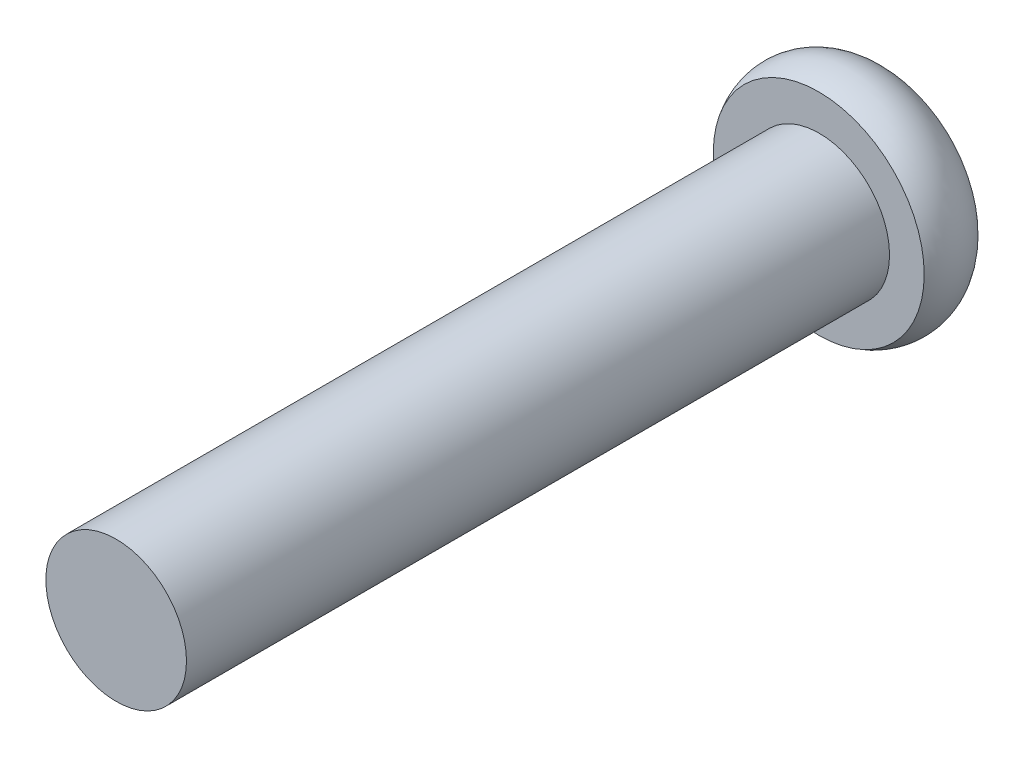
ISO-10303-21;
HEADER;
FILE_DESCRIPTION(('STEP AP214'),'2;1');
FILE_NAME('part.step','',(''),(''),'','','');
FILE_SCHEMA(('AUTOMOTIVE_DESIGN { 1 0 10303 214 1 1 1 1 }'));
ENDSEC;
DATA;
#1=APPLICATION_CONTEXT('core data for automotive mechanical design processes');
#2=APPLICATION_PROTOCOL_DEFINITION('international standard','automotive_design',2000,#1);
#3=PRODUCT_CONTEXT('',#1,'mechanical');
#4=PRODUCT('Part','Part','',(#3));
#5=PRODUCT_RELATED_PRODUCT_CATEGORY('part','',(#4));
#6=PRODUCT_DEFINITION_FORMATION('','',#4);
#7=PRODUCT_DEFINITION_CONTEXT('part definition',#1,'design');
#8=PRODUCT_DEFINITION('design','',#6,#7);
#9=PRODUCT_DEFINITION_SHAPE('','',#8);
#10=(LENGTH_UNIT() NAMED_UNIT(*) SI_UNIT(.MILLI.,.METRE.));
#11=(NAMED_UNIT(*) PLANE_ANGLE_UNIT() SI_UNIT($,.RADIAN.));
#12=(NAMED_UNIT(*) SI_UNIT($,.STERADIAN.) SOLID_ANGLE_UNIT());
#13=UNCERTAINTY_MEASURE_WITH_UNIT(LENGTH_MEASURE(1.E-05),#10,'distance_accuracy_value','');
#14=(GEOMETRIC_REPRESENTATION_CONTEXT(3) GLOBAL_UNCERTAINTY_ASSIGNED_CONTEXT((#13)) GLOBAL_UNIT_ASSIGNED_CONTEXT((#10,
#11,#12)) REPRESENTATION_CONTEXT('',''));
#15=CARTESIAN_POINT('',(0.,0.,0.));
#16=DIRECTION('',(0.,0.,1.));
#17=DIRECTION('',(1.,0.,0.));
#18=AXIS2_PLACEMENT_3D('',#15,#16,#17);
#19=CARTESIAN_POINT('',(0.,0.,0.));
#20=DIRECTION('',(0.,0.,1.));
#21=DIRECTION('',(1.,0.,0.));
#22=AXIS2_PLACEMENT_3D('',#19,#20,#21);
#23=PLANE('',#22);
#24=CARTESIAN_POINT('',(0.,0.,0.));
#25=DIRECTION('',(0.,0.,1.));
#26=DIRECTION('',(1.,0.,0.));
#27=AXIS2_PLACEMENT_3D('',#24,#25,#26);
#28=CIRCLE('',#27,3.);
#29=CARTESIAN_POINT('',(3.,0.,0.));
#30=VERTEX_POINT('',#29);
#31=EDGE_CURVE('E156',#30,#30,#28,.T.);
#32=ORIENTED_EDGE('',*,*,#31,.T.);
#33=EDGE_LOOP('',(#32));
#34=FACE_BOUND('',#33,.T.);
#35=CARTESIAN_POINT('',(0.0135896024399493,-0.0135896024399496,0.));
#36=DIRECTION('',(0.,0.,1.));
#37=DIRECTION('',(1.,0.,0.));
#38=AXIS2_PLACEMENT_3D('',#35,#36,#37);
#39=CIRCLE('',#38,2.);
#40=CARTESIAN_POINT('',(2.01358960243995,-0.0135896024399496,0.));
#41=VERTEX_POINT('',#40);
#42=EDGE_CURVE('E184',#41,#41,#39,.T.);
#43=ORIENTED_EDGE('',*,*,#42,.F.);
#44=EDGE_LOOP('',(#43));
#45=FACE_BOUND('',#44,.T.);
#46=ADVANCED_FACE('F35',(#34,#45),#23,.T.);
#47=CARTESIAN_POINT('',(0.,0.,-2.));
#48=DIRECTION('',(0.,0.,-1.));
#49=DIRECTION('',(-1.,0.,0.));
#50=AXIS2_PLACEMENT_3D('',#47,#48,#49);
#51=PLANE('',#50);
#52=DIRECTION('',(0.,1.,0.));
#53=VECTOR('',#52,1.);
#54=CARTESIAN_POINT('',(-0.5,-0.5,-2.));
#55=LINE('',#54,#53);
#56=CARTESIAN_POINT('',(-0.5,-2.,-2.));
#57=VERTEX_POINT('',#56);
#58=CARTESIAN_POINT('',(-0.5,-0.5,-2.));
#59=VERTEX_POINT('',#58);
#60=EDGE_CURVE('E49',#57,#59,#55,.T.);
#61=ORIENTED_EDGE('',*,*,#60,.F.);
#62=DIRECTION('',(-1.,0.,0.));
#63=VECTOR('',#62,1.);
#64=CARTESIAN_POINT('',(0.5,-2.,-2.));
#65=LINE('',#64,#63);
#66=CARTESIAN_POINT('',(0.5,-2.,-2.));
#67=VERTEX_POINT('',#66);
#68=EDGE_CURVE('E152',#67,#57,#65,.T.);
#69=ORIENTED_EDGE('',*,*,#68,.F.);
#70=DIRECTION('',(0.,-1.,0.));
#71=VECTOR('',#70,1.);
#72=CARTESIAN_POINT('',(0.5,-0.5,-2.));
#73=LINE('',#72,#71);
#74=CARTESIAN_POINT('',(0.5,-0.5,-2.));
#75=VERTEX_POINT('',#74);
#76=EDGE_CURVE('E216',#75,#67,#73,.T.);
#77=ORIENTED_EDGE('',*,*,#76,.F.);
#78=DIRECTION('',(-1.,0.,0.));
#79=VECTOR('',#78,1.);
#80=CARTESIAN_POINT('',(2.,-0.5,-2.));
#81=LINE('',#80,#79);
#82=CARTESIAN_POINT('',(2.,-0.5,-2.));
#83=VERTEX_POINT('',#82);
#84=EDGE_CURVE('E213',#83,#75,#81,.T.);
#85=ORIENTED_EDGE('',*,*,#84,.F.);
#86=DIRECTION('',(0.,-1.,0.));
#87=VECTOR('',#86,1.);
#88=CARTESIAN_POINT('',(2.,0.5,-2.));
#89=LINE('',#88,#87);
#90=CARTESIAN_POINT('',(2.,0.5,-2.));
#91=VERTEX_POINT('',#90);
#92=EDGE_CURVE('E210',#91,#83,#89,.T.);
#93=ORIENTED_EDGE('',*,*,#92,.F.);
#94=DIRECTION('',(1.,0.,0.));
#95=VECTOR('',#94,1.);
#96=CARTESIAN_POINT('',(2.,0.5,-2.));
#97=LINE('',#96,#95);
#98=CARTESIAN_POINT('',(0.5,0.5,-2.));
#99=VERTEX_POINT('',#98);
#100=EDGE_CURVE('E207',#99,#91,#97,.T.);
#101=ORIENTED_EDGE('',*,*,#100,.F.);
#102=DIRECTION('',(0.,-1.,0.));
#103=VECTOR('',#102,1.);
#104=CARTESIAN_POINT('',(0.5,2.,-2.));
#105=LINE('',#104,#103);
#106=CARTESIAN_POINT('',(0.5,2.,-2.));
#107=VERTEX_POINT('',#106);
#108=EDGE_CURVE('E204',#107,#99,#105,.T.);
#109=ORIENTED_EDGE('',*,*,#108,.F.);
#110=DIRECTION('',(1.,0.,0.));
#111=VECTOR('',#110,1.);
#112=CARTESIAN_POINT('',(0.5,2.,-2.));
#113=LINE('',#112,#111);
#114=CARTESIAN_POINT('',(-0.5,2.,-2.));
#115=VERTEX_POINT('',#114);
#116=EDGE_CURVE('E201',#115,#107,#113,.T.);
#117=ORIENTED_EDGE('',*,*,#116,.F.);
#118=DIRECTION('',(0.,1.,0.));
#119=VECTOR('',#118,1.);
#120=CARTESIAN_POINT('',(-0.5,2.,-2.));
#121=LINE('',#120,#119);
#122=CARTESIAN_POINT('',(-0.5,0.5,-2.));
#123=VERTEX_POINT('',#122);
#124=EDGE_CURVE('E198',#123,#115,#121,.T.);
#125=ORIENTED_EDGE('',*,*,#124,.F.);
#126=DIRECTION('',(1.,0.,0.));
#127=VECTOR('',#126,1.);
#128=CARTESIAN_POINT('',(-0.5,0.5,-2.));
#129=LINE('',#128,#127);
#130=CARTESIAN_POINT('',(-2.,0.5,-2.));
#131=VERTEX_POINT('',#130);
#132=EDGE_CURVE('E195',#131,#123,#129,.T.);
#133=ORIENTED_EDGE('',*,*,#132,.F.);
#134=DIRECTION('',(0.,1.,0.));
#135=VECTOR('',#134,1.);
#136=CARTESIAN_POINT('',(-2.,0.5,-2.));
#137=LINE('',#136,#135);
#138=CARTESIAN_POINT('',(-2.,-0.5,-2.));
#139=VERTEX_POINT('',#138);
#140=EDGE_CURVE('E193',#139,#131,#137,.T.);
#141=ORIENTED_EDGE('',*,*,#140,.F.);
#142=DIRECTION('',(-1.,0.,0.));
#143=VECTOR('',#142,1.);
#144=CARTESIAN_POINT('',(-0.5,-0.5,-2.));
#145=LINE('',#144,#143);
#146=EDGE_CURVE('E134',#59,#139,#145,.T.);
#147=ORIENTED_EDGE('',*,*,#146,.F.);
#148=EDGE_LOOP('',(#61,#69,#77,#85,#93,#101,#109,#117,#125,#133,#141,#147));
#149=FACE_BOUND('',#148,.T.);
#150=CARTESIAN_POINT('',(0.,0.,-2.));
#151=DIRECTION('',(0.,0.,1.));
#152=DIRECTION('',(1.,0.,0.));
#153=AXIS2_PLACEMENT_3D('',#150,#151,#152);
#154=CIRCLE('',#153,2.29828566126008);
#155=CARTESIAN_POINT('',(2.29828566126008,0.,-2.));
#156=VERTEX_POINT('',#155);
#157=EDGE_CURVE('E11',#156,#156,#154,.T.);
#158=ORIENTED_EDGE('',*,*,#157,.F.);
#159=EDGE_LOOP('',(#158));
#160=FACE_BOUND('',#159,.T.);
#161=ADVANCED_FACE('F166',(#149,#160),#51,.T.);
#162=CARTESIAN_POINT('',(0.,0.,-1.5));
#163=DIRECTION('',(0.,0.,1.));
#164=DIRECTION('',(1.,0.,0.));
#165=AXIS2_PLACEMENT_3D('',#162,#163,#164);
#166=TOROIDAL_SURFACE('',#165,2.29828566126008,0.5);
#167=ORIENTED_EDGE('',*,*,#157,.T.);
#168=EDGE_LOOP('',(#167));
#169=FACE_BOUND('',#168,.T.);
#170=CARTESIAN_POINT('',(0.,0.,-1.91742578561798));
#171=DIRECTION('',(0.,0.,1.));
#172=DIRECTION('',(1.,0.,0.));
#173=AXIS2_PLACEMENT_3D('',#170,#171,#172);
#174=CIRCLE('',#173,2.5735232195642);
#175=CARTESIAN_POINT('',(2.5735232195642,0.,-1.91742578561798));
#176=VERTEX_POINT('',#175);
#177=EDGE_CURVE('E42',#176,#176,#174,.T.);
#178=ORIENTED_EDGE('',*,*,#177,.F.);
#179=EDGE_LOOP('',(#178));
#180=FACE_BOUND('',#179,.T.);
#181=ADVANCED_FACE('F164',(#169,#180),#166,.T.);
#182=CARTESIAN_POINT('',(0.,0.,-0.738365689933416));
#183=DIRECTION('',(0.,0.,1.));
#184=DIRECTION('',(1.,0.,0.));
#185=AXIS2_PLACEMENT_3D('',#182,#183,#184);
#186=TOROIDAL_SURFACE('',#185,1.79608772561263,1.41229906765225);
#187=ORIENTED_EDGE('',*,*,#177,.T.);
#188=EDGE_LOOP('',(#187));
#189=FACE_BOUND('',#188,.T.);
#190=ORIENTED_EDGE('',*,*,#31,.F.);
#191=EDGE_LOOP('',(#190));
#192=FACE_BOUND('',#191,.T.);
#193=ADVANCED_FACE('F161',(#189,#192),#186,.T.);
#194=CARTESIAN_POINT('',(-0.5,-0.5,-2.));
#195=DIRECTION('',(-0.978147600733806,0.,0.20791169081776));
#196=DIRECTION('',(0.20791169081776,0.,0.978147600733806));
#197=AXIS2_PLACEMENT_3D('',#194,#195,#196);
#198=PLANE('',#197);
#199=ORIENTED_EDGE('',*,*,#60,.T.);
#200=DIRECTION('',(-0.203558594952779,-0.203558594952779,-0.957667894857973));
#201=VECTOR('',#200,1.);
#202=CARTESIAN_POINT('',(-0.5,-0.5,-2.));
#203=LINE('',#202,#201);
#204=CARTESIAN_POINT('',(-0.0748868766599549,-0.074886876659955,0.));
#205=VERTEX_POINT('',#204);
#206=EDGE_CURVE('E89',#205,#59,#203,.T.);
#207=ORIENTED_EDGE('',*,*,#206,.F.);
#208=DIRECTION('',(0.,1.,0.));
#209=VECTOR('',#208,1.);
#210=CARTESIAN_POINT('',(-0.0748868766599548,0.,0.));
#211=LINE('',#210,#209);
#212=CARTESIAN_POINT('',(-0.0748868766599552,-1.57488687665996,0.));
#213=VERTEX_POINT('',#212);
#214=EDGE_CURVE('E150',#213,#205,#211,.T.);
#215=ORIENTED_EDGE('',*,*,#214,.F.);
#216=DIRECTION('',(-0.203558594952779,-0.203558594952779,-0.957667894857973));
#217=VECTOR('',#216,1.);
#218=CARTESIAN_POINT('',(-0.45856389842085,-1.95856389842085,-1.80505846889133));
#219=LINE('',#218,#217);
#220=EDGE_CURVE('E57',#213,#57,#219,.T.);
#221=ORIENTED_EDGE('',*,*,#220,.T.);
#222=EDGE_LOOP('',(#199,#207,#215,#221));
#223=FACE_BOUND('',#222,.T.);
#224=ADVANCED_FACE('F173',(#223),#198,.F.);
#225=CARTESIAN_POINT('',(0.5,-2.,-2.));
#226=DIRECTION('',(0.,-0.978147600733806,0.20791169081776));
#227=DIRECTION('',(0.,-0.20791169081776,-0.978147600733806));
#228=AXIS2_PLACEMENT_3D('',#225,#226,#227);
#229=PLANE('',#228);
#230=ORIENTED_EDGE('',*,*,#68,.T.);
#231=ORIENTED_EDGE('',*,*,#220,.F.);
#232=DIRECTION('',(-1.,0.,0.));
#233=VECTOR('',#232,1.);
#234=CARTESIAN_POINT('',(0.,-1.57488687665995,0.));
#235=LINE('',#234,#233);
#236=CARTESIAN_POINT('',(0.0748868766599548,-1.57488687665996,0.));
#237=VERTEX_POINT('',#236);
#238=EDGE_CURVE('E220',#237,#213,#235,.T.);
#239=ORIENTED_EDGE('',*,*,#238,.F.);
#240=DIRECTION('',(0.203558594952779,-0.203558594952779,-0.957667894857973));
#241=VECTOR('',#240,1.);
#242=CARTESIAN_POINT('',(0.437845847631275,-1.93784584763128,-1.70758770333699));
#243=LINE('',#242,#241);
#244=EDGE_CURVE('E94',#237,#67,#243,.T.);
#245=ORIENTED_EDGE('',*,*,#244,.T.);
#246=EDGE_LOOP('',(#230,#231,#239,#245));
#247=FACE_BOUND('',#246,.T.);
#248=ADVANCED_FACE('F291',(#247),#229,.F.);
#249=CARTESIAN_POINT('',(0.5,-0.5,-2.));
#250=DIRECTION('',(0.978147600733806,0.,0.20791169081776));
#251=DIRECTION('',(0.20791169081776,0.,-0.978147600733806));
#252=AXIS2_PLACEMENT_3D('',#249,#250,#251);
#253=PLANE('',#252);
#254=ORIENTED_EDGE('',*,*,#76,.T.);
#255=ORIENTED_EDGE('',*,*,#244,.F.);
#256=DIRECTION('',(0.,-1.,0.));
#257=VECTOR('',#256,1.);
#258=CARTESIAN_POINT('',(0.0748868766599551,0.,0.));
#259=LINE('',#258,#257);
#260=CARTESIAN_POINT('',(0.0748868766599551,-0.074886876659955,0.));
#261=VERTEX_POINT('',#260);
#262=EDGE_CURVE('E239',#261,#237,#259,.T.);
#263=ORIENTED_EDGE('',*,*,#262,.F.);
#264=DIRECTION('',(0.203558594952779,-0.203558594952779,-0.957667894857973));
#265=VECTOR('',#264,1.);
#266=CARTESIAN_POINT('',(0.5,-0.5,-2.));
#267=LINE('',#266,#265);
#268=EDGE_CURVE('E235',#261,#75,#267,.T.);
#269=ORIENTED_EDGE('',*,*,#268,.T.);
#270=EDGE_LOOP('',(#254,#255,#263,#269));
#271=FACE_BOUND('',#270,.T.);
#272=ADVANCED_FACE('F289',(#271),#253,.F.);
#273=CARTESIAN_POINT('',(2.,-0.5,-2.));
#274=DIRECTION('',(0.,-0.978147600733806,0.20791169081776));
#275=DIRECTION('',(0.,-0.20791169081776,-0.978147600733806));
#276=AXIS2_PLACEMENT_3D('',#273,#274,#275);
#277=PLANE('',#276);
#278=ORIENTED_EDGE('',*,*,#84,.T.);
#279=ORIENTED_EDGE('',*,*,#268,.F.);
#280=DIRECTION('',(-1.,0.,0.));
#281=VECTOR('',#280,1.);
#282=CARTESIAN_POINT('',(0.,-0.0748868766599549,0.));
#283=LINE('',#282,#281);
#284=CARTESIAN_POINT('',(1.57488687665996,-0.074886876659955,0.));
#285=VERTEX_POINT('',#284);
#286=EDGE_CURVE('E242',#285,#261,#283,.T.);
#287=ORIENTED_EDGE('',*,*,#286,.F.);
#288=DIRECTION('',(0.203558594952779,-0.203558594952779,-0.957667894857973));
#289=VECTOR('',#288,1.);
#290=CARTESIAN_POINT('',(1.95856389842085,-0.45856389842085,-1.80505846889133));
#291=LINE('',#290,#289);
#292=EDGE_CURVE('E233',#285,#83,#291,.T.);
#293=ORIENTED_EDGE('',*,*,#292,.T.);
#294=EDGE_LOOP('',(#278,#279,#287,#293));
#295=FACE_BOUND('',#294,.T.);
#296=ADVANCED_FACE('F285',(#295),#277,.F.);
#297=CARTESIAN_POINT('',(2.,0.5,-2.));
#298=DIRECTION('',(0.978147600733806,0.,0.20791169081776));
#299=DIRECTION('',(0.20791169081776,0.,-0.978147600733806));
#300=AXIS2_PLACEMENT_3D('',#297,#298,#299);
#301=PLANE('',#300);
#302=ORIENTED_EDGE('',*,*,#92,.T.);
#303=ORIENTED_EDGE('',*,*,#292,.F.);
#304=DIRECTION('',(0.,-1.,0.));
#305=VECTOR('',#304,1.);
#306=CARTESIAN_POINT('',(1.57488687665995,0.,0.));
#307=LINE('',#306,#305);
#308=CARTESIAN_POINT('',(1.57488687665996,0.0748868766599549,0.));
#309=VERTEX_POINT('',#308);
#310=EDGE_CURVE('E245',#309,#285,#307,.T.);
#311=ORIENTED_EDGE('',*,*,#310,.F.);
#312=DIRECTION('',(0.203558594952779,0.203558594952779,-0.957667894857973));
#313=VECTOR('',#312,1.);
#314=CARTESIAN_POINT('',(2.,0.5,-2.));
#315=LINE('',#314,#313);
#316=EDGE_CURVE('E231',#309,#91,#315,.T.);
#317=ORIENTED_EDGE('',*,*,#316,.T.);
#318=EDGE_LOOP('',(#302,#303,#311,#317));
#319=FACE_BOUND('',#318,.T.);
#320=ADVANCED_FACE('F281',(#319),#301,.F.);
#321=CARTESIAN_POINT('',(2.,0.5,-2.));
#322=DIRECTION('',(0.,0.978147600733805,0.20791169081776));
#323=DIRECTION('',(0.,-0.20791169081776,0.978147600733806));
#324=AXIS2_PLACEMENT_3D('',#321,#322,#323);
#325=PLANE('',#324);
#326=ORIENTED_EDGE('',*,*,#100,.T.);
#327=ORIENTED_EDGE('',*,*,#316,.F.);
#328=DIRECTION('',(1.,0.,0.));
#329=VECTOR('',#328,1.);
#330=CARTESIAN_POINT('',(0.,0.074886876659955,0.));
#331=LINE('',#330,#329);
#332=CARTESIAN_POINT('',(0.0748868766599547,0.0748868766599549,0.));
#333=VERTEX_POINT('',#332);
#334=EDGE_CURVE('E248',#333,#309,#331,.T.);
#335=ORIENTED_EDGE('',*,*,#334,.F.);
#336=DIRECTION('',(0.203558594952779,0.203558594952779,-0.957667894857973));
#337=VECTOR('',#336,1.);
#338=CARTESIAN_POINT('',(0.562154152368724,0.562154152368725,-2.29241229666301));
#339=LINE('',#338,#337);
#340=EDGE_CURVE('E229',#333,#99,#339,.T.);
#341=ORIENTED_EDGE('',*,*,#340,.T.);
#342=EDGE_LOOP('',(#326,#327,#335,#341));
#343=FACE_BOUND('',#342,.T.);
#344=ADVANCED_FACE('F277',(#343),#325,.F.);
#345=CARTESIAN_POINT('',(0.5,2.,-2.));
#346=DIRECTION('',(0.978147600733806,0.,0.20791169081776));
#347=DIRECTION('',(0.20791169081776,0.,-0.978147600733806));
#348=AXIS2_PLACEMENT_3D('',#345,#346,#347);
#349=PLANE('',#348);
#350=ORIENTED_EDGE('',*,*,#108,.T.);
#351=ORIENTED_EDGE('',*,*,#340,.F.);
#352=DIRECTION('',(0.,-1.,0.));
#353=VECTOR('',#352,1.);
#354=CARTESIAN_POINT('',(0.0748868766599546,0.,0.));
#355=LINE('',#354,#353);
#356=CARTESIAN_POINT('',(0.0748868766599549,1.57488687665996,0.));
#357=VERTEX_POINT('',#356);
#358=EDGE_CURVE('E251',#357,#333,#355,.T.);
#359=ORIENTED_EDGE('',*,*,#358,.F.);
#360=DIRECTION('',(0.203558594952779,0.203558594952779,-0.957667894857973));
#361=VECTOR('',#360,1.);
#362=CARTESIAN_POINT('',(0.5,2.,-2.));
#363=LINE('',#362,#361);
#364=EDGE_CURVE('E227',#357,#107,#363,.T.);
#365=ORIENTED_EDGE('',*,*,#364,.T.);
#366=EDGE_LOOP('',(#350,#351,#359,#365));
#367=FACE_BOUND('',#366,.T.);
#368=ADVANCED_FACE('F273',(#367),#349,.F.);
#369=CARTESIAN_POINT('',(0.5,2.,-2.));
#370=DIRECTION('',(0.,0.978147600733806,0.20791169081776));
#371=DIRECTION('',(0.,-0.20791169081776,0.978147600733806));
#372=AXIS2_PLACEMENT_3D('',#369,#370,#371);
#373=PLANE('',#372);
#374=ORIENTED_EDGE('',*,*,#116,.T.);
#375=ORIENTED_EDGE('',*,*,#364,.F.);
#376=DIRECTION('',(1.,0.,0.));
#377=VECTOR('',#376,1.);
#378=CARTESIAN_POINT('',(0.,1.57488687665995,0.));
#379=LINE('',#378,#377);
#380=CARTESIAN_POINT('',(-0.0748868766599548,1.57488687665996,0.));
#381=VERTEX_POINT('',#380);
#382=EDGE_CURVE('E254',#381,#357,#379,.T.);
#383=ORIENTED_EDGE('',*,*,#382,.F.);
#384=DIRECTION('',(-0.203558594952779,0.203558594952779,-0.957667894857973));
#385=VECTOR('',#384,1.);
#386=CARTESIAN_POINT('',(-0.5,2.,-2.));
#387=LINE('',#386,#385);
#388=EDGE_CURVE('E225',#381,#115,#387,.T.);
#389=ORIENTED_EDGE('',*,*,#388,.T.);
#390=EDGE_LOOP('',(#374,#375,#383,#389));
#391=FACE_BOUND('',#390,.T.);
#392=ADVANCED_FACE('F269',(#391),#373,.F.);
#393=CARTESIAN_POINT('',(-0.5,2.,-2.));
#394=DIRECTION('',(-0.978147600733806,0.,0.20791169081776));
#395=DIRECTION('',(0.20791169081776,0.,0.978147600733806));
#396=AXIS2_PLACEMENT_3D('',#393,#394,#395);
#397=PLANE('',#396);
#398=ORIENTED_EDGE('',*,*,#124,.T.);
#399=ORIENTED_EDGE('',*,*,#388,.F.);
#400=DIRECTION('',(0.,1.,0.));
#401=VECTOR('',#400,1.);
#402=CARTESIAN_POINT('',(-0.0748868766599548,0.,0.));
#403=LINE('',#402,#401);
#404=CARTESIAN_POINT('',(-0.0748868766599549,0.074886876659955,0.));
#405=VERTEX_POINT('',#404);
#406=EDGE_CURVE('E257',#405,#381,#403,.T.);
#407=ORIENTED_EDGE('',*,*,#406,.F.);
#408=DIRECTION('',(-0.203558594952779,0.203558594952779,-0.957667894857973));
#409=VECTOR('',#408,1.);
#410=CARTESIAN_POINT('',(-0.562154152368724,0.562154152368725,-2.29241229666301));
#411=LINE('',#410,#409);
#412=EDGE_CURVE('E223',#405,#123,#411,.T.);
#413=ORIENTED_EDGE('',*,*,#412,.T.);
#414=EDGE_LOOP('',(#398,#399,#407,#413));
#415=FACE_BOUND('',#414,.T.);
#416=ADVANCED_FACE('F265',(#415),#397,.F.);
#417=CARTESIAN_POINT('',(-0.5,0.5,-2.));
#418=DIRECTION('',(0.,0.978147600733806,0.20791169081776));
#419=DIRECTION('',(0.,-0.20791169081776,0.978147600733806));
#420=AXIS2_PLACEMENT_3D('',#417,#418,#419);
#421=PLANE('',#420);
#422=ORIENTED_EDGE('',*,*,#132,.T.);
#423=ORIENTED_EDGE('',*,*,#412,.F.);
#424=DIRECTION('',(1.,0.,0.));
#425=VECTOR('',#424,1.);
#426=CARTESIAN_POINT('',(0.,0.0748868766599549,0.));
#427=LINE('',#426,#425);
#428=CARTESIAN_POINT('',(-1.57488687665996,0.074886876659955,0.));
#429=VERTEX_POINT('',#428);
#430=EDGE_CURVE('E146',#429,#405,#427,.T.);
#431=ORIENTED_EDGE('',*,*,#430,.F.);
#432=DIRECTION('',(-0.203558594952779,0.203558594952779,-0.957667894857973));
#433=VECTOR('',#432,1.);
#434=CARTESIAN_POINT('',(-2.,0.5,-2.));
#435=LINE('',#434,#433);
#436=EDGE_CURVE('E138',#429,#131,#435,.T.);
#437=ORIENTED_EDGE('',*,*,#436,.T.);
#438=EDGE_LOOP('',(#422,#423,#431,#437));
#439=FACE_BOUND('',#438,.T.);
#440=ADVANCED_FACE('F261',(#439),#421,.F.);
#441=CARTESIAN_POINT('',(-2.,0.5,-2.));
#442=DIRECTION('',(-0.978147600733806,0.,0.20791169081776));
#443=DIRECTION('',(0.20791169081776,0.,0.978147600733806));
#444=AXIS2_PLACEMENT_3D('',#441,#442,#443);
#445=PLANE('',#444);
#446=ORIENTED_EDGE('',*,*,#140,.T.);
#447=ORIENTED_EDGE('',*,*,#436,.F.);
#448=DIRECTION('',(0.,1.,0.));
#449=VECTOR('',#448,1.);
#450=CARTESIAN_POINT('',(-1.57488687665995,0.,0.));
#451=LINE('',#450,#449);
#452=CARTESIAN_POINT('',(-1.57488687665995,-0.074886876659955,0.));
#453=VERTEX_POINT('',#452);
#454=EDGE_CURVE('E141',#453,#429,#451,.T.);
#455=ORIENTED_EDGE('',*,*,#454,.F.);
#456=DIRECTION('',(-0.203558594952779,-0.203558594952779,-0.957667894857973));
#457=VECTOR('',#456,1.);
#458=CARTESIAN_POINT('',(-1.93784584763128,-0.437845847631276,-1.70758770333699));
#459=LINE('',#458,#457);
#460=EDGE_CURVE('E127',#453,#139,#459,.T.);
#461=ORIENTED_EDGE('',*,*,#460,.T.);
#462=EDGE_LOOP('',(#446,#447,#455,#461));
#463=FACE_BOUND('',#462,.T.);
#464=ADVANCED_FACE('F142',(#463),#445,.F.);
#465=CARTESIAN_POINT('',(-0.5,-0.5,-2.));
#466=DIRECTION('',(0.,-0.978147600733806,0.20791169081776));
#467=DIRECTION('',(0.,-0.20791169081776,-0.978147600733806));
#468=AXIS2_PLACEMENT_3D('',#465,#466,#467);
#469=PLANE('',#468);
#470=ORIENTED_EDGE('',*,*,#146,.T.);
#471=ORIENTED_EDGE('',*,*,#460,.F.);
#472=DIRECTION('',(-1.,0.,0.));
#473=VECTOR('',#472,1.);
#474=CARTESIAN_POINT('',(0.,-0.0748868766599549,0.));
#475=LINE('',#474,#473);
#476=EDGE_CURVE('E131',#205,#453,#475,.T.);
#477=ORIENTED_EDGE('',*,*,#476,.F.);
#478=ORIENTED_EDGE('',*,*,#206,.T.);
#479=EDGE_LOOP('',(#470,#471,#477,#478));
#480=FACE_BOUND('',#479,.T.);
#481=ADVANCED_FACE('F129',(#480),#469,.F.);
#482=CARTESIAN_POINT('',(0.0135896024399493,-0.0135896024399496,0.));
#483=DIRECTION('',(0.,0.,1.));
#484=DIRECTION('',(1.,0.,0.));
#485=AXIS2_PLACEMENT_3D('',#482,#483,#484);
#486=PLANE('',#485);
#487=ORIENTED_EDGE('',*,*,#238,.T.);
#488=ORIENTED_EDGE('',*,*,#214,.T.);
#489=ORIENTED_EDGE('',*,*,#476,.T.);
#490=ORIENTED_EDGE('',*,*,#454,.T.);
#491=ORIENTED_EDGE('',*,*,#430,.T.);
#492=ORIENTED_EDGE('',*,*,#406,.T.);
#493=ORIENTED_EDGE('',*,*,#382,.T.);
#494=ORIENTED_EDGE('',*,*,#358,.T.);
#495=ORIENTED_EDGE('',*,*,#334,.T.);
#496=ORIENTED_EDGE('',*,*,#310,.T.);
#497=ORIENTED_EDGE('',*,*,#286,.T.);
#498=ORIENTED_EDGE('',*,*,#262,.T.);
#499=EDGE_LOOP('',(#487,#488,#489,#490,#491,#492,#493,#494,#495,#496,#497,#498));
#500=FACE_BOUND('',#499,.T.);
#501=ADVANCED_FACE('F149',(#500),#486,.F.);
#502=CARTESIAN_POINT('',(0.0135896024399493,-0.0135896024399496,20.));
#503=DIRECTION('',(0.,0.,-1.));
#504=DIRECTION('',(-1.,0.,0.));
#505=AXIS2_PLACEMENT_3D('',#502,#503,#504);
#506=CYLINDRICAL_SURFACE('',#505,2.);
#507=CARTESIAN_POINT('',(0.0135896024399493,-0.0135896024399496,20.));
#508=DIRECTION('',(0.,0.,1.));
#509=DIRECTION('',(1.,0.,0.));
#510=AXIS2_PLACEMENT_3D('',#507,#508,#509);
#511=CIRCLE('',#510,2.);
#512=CARTESIAN_POINT('',(2.01358960243995,-0.0135896024399496,20.));
#513=VERTEX_POINT('',#512);
#514=EDGE_CURVE('E186',#513,#513,#511,.T.);
#515=ORIENTED_EDGE('',*,*,#514,.F.);
#516=EDGE_LOOP('',(#515));
#517=FACE_BOUND('',#516,.T.);
#518=ORIENTED_EDGE('',*,*,#42,.T.);
#519=EDGE_LOOP('',(#518));
#520=FACE_BOUND('',#519,.T.);
#521=ADVANCED_FACE('F319',(#517,#520),#506,.T.);
#522=CARTESIAN_POINT('',(0.0135896024399493,-0.0135896024399496,20.));
#523=DIRECTION('',(0.,0.,1.));
#524=DIRECTION('',(1.,0.,0.));
#525=AXIS2_PLACEMENT_3D('',#522,#523,#524);
#526=PLANE('',#525);
#527=ORIENTED_EDGE('',*,*,#514,.T.);
#528=EDGE_LOOP('',(#527));
#529=FACE_BOUND('',#528,.T.);
#530=ADVANCED_FACE('F322',(#529),#526,.T.);
#531=CLOSED_SHELL('',(#46,#161,#181,#193,#224,#248,#272,#296,#320,#344,#368,#392,#416,#440,#464,
#481,#501,#521,#530));
#532=MANIFOLD_SOLID_BREP('B2',#531);
#533=ADVANCED_BREP_SHAPE_REPRESENTATION('',(#18,#532),#14);
#534=SHAPE_DEFINITION_REPRESENTATION(#9,#533);
ENDSEC;
END-ISO-10303-21;
